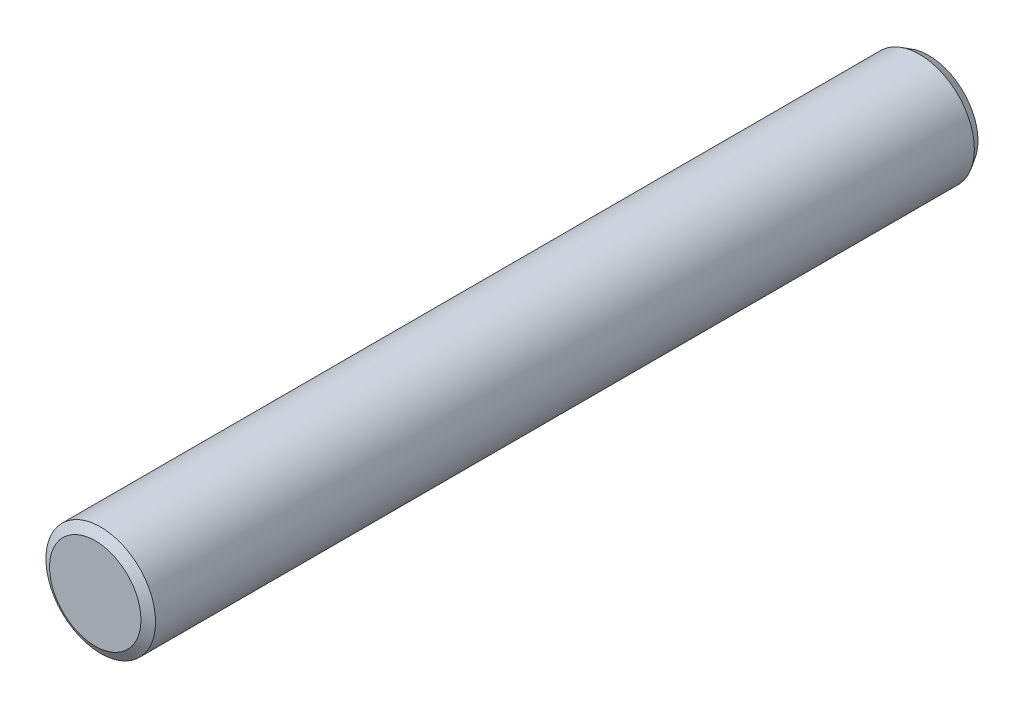
ISO-10303-21;
HEADER;
FILE_DESCRIPTION(('STEP AP214'),'2;1');
FILE_NAME('part.step','',(''),(''),'','','');
FILE_SCHEMA(('AUTOMOTIVE_DESIGN { 1 0 10303 214 1 1 1 1 }'));
ENDSEC;
DATA;
#1=APPLICATION_CONTEXT('core data for automotive mechanical design processes');
#2=APPLICATION_PROTOCOL_DEFINITION('international standard','automotive_design',2000,#1);
#3=PRODUCT_CONTEXT('',#1,'mechanical');
#4=PRODUCT('Part','Part','',(#3));
#5=PRODUCT_RELATED_PRODUCT_CATEGORY('part','',(#4));
#6=PRODUCT_DEFINITION_FORMATION('','',#4);
#7=PRODUCT_DEFINITION_CONTEXT('part definition',#1,'design');
#8=PRODUCT_DEFINITION('design','',#6,#7);
#9=PRODUCT_DEFINITION_SHAPE('','',#8);
#10=(LENGTH_UNIT() NAMED_UNIT(*) SI_UNIT(.MILLI.,.METRE.));
#11=(NAMED_UNIT(*) PLANE_ANGLE_UNIT() SI_UNIT($,.RADIAN.));
#12=(NAMED_UNIT(*) SI_UNIT($,.STERADIAN.) SOLID_ANGLE_UNIT());
#13=UNCERTAINTY_MEASURE_WITH_UNIT(LENGTH_MEASURE(1.E-05),#10,'distance_accuracy_value','');
#14=(GEOMETRIC_REPRESENTATION_CONTEXT(3) GLOBAL_UNCERTAINTY_ASSIGNED_CONTEXT((#13)) GLOBAL_UNIT_ASSIGNED_CONTEXT((#10,
#11,#12)) REPRESENTATION_CONTEXT('',''));
#15=CARTESIAN_POINT('',(0.,0.,0.));
#16=DIRECTION('',(0.,0.,1.));
#17=DIRECTION('',(1.,0.,0.));
#18=AXIS2_PLACEMENT_3D('',#15,#16,#17);
#19=CARTESIAN_POINT('',(0.,0.,76.));
#20=DIRECTION('',(0.,0.,-1.));
#21=DIRECTION('',(-1.,0.,0.));
#22=AXIS2_PLACEMENT_3D('',#19,#20,#21);
#23=CYLINDRICAL_SURFACE('',#22,5.);
#24=CARTESIAN_POINT('',(0.,0.,0.832139741175242));
#25=DIRECTION('',(0.,0.,1.));
#26=DIRECTION('',(1.,0.,0.));
#27=AXIS2_PLACEMENT_3D('',#24,#25,#26);
#28=CIRCLE('',#27,5.);
#29=CARTESIAN_POINT('',(5.,0.,0.832139741175242));
#30=VERTEX_POINT('',#29);
#31=EDGE_CURVE('E51',#30,#30,#28,.T.);
#32=ORIENTED_EDGE('',*,*,#31,.T.);
#33=EDGE_LOOP('',(#32));
#34=FACE_BOUND('',#33,.T.);
#35=CARTESIAN_POINT('',(0.,0.,75.5));
#36=DIRECTION('',(0.,0.,1.));
#37=DIRECTION('',(1.,0.,0.));
#38=AXIS2_PLACEMENT_3D('',#35,#36,#37);
#39=CIRCLE('',#38,5.);
#40=CARTESIAN_POINT('',(5.,0.,75.5));
#41=VERTEX_POINT('',#40);
#42=EDGE_CURVE('E55',#41,#41,#39,.F.);
#43=ORIENTED_EDGE('',*,*,#42,.T.);
#44=EDGE_LOOP('',(#43));
#45=FACE_BOUND('',#44,.T.);
#46=ADVANCED_FACE('F39',(#34,#45),#23,.T.);
#47=CARTESIAN_POINT('',(0.,0.,76.));
#48=DIRECTION('',(0.,0.,1.));
#49=DIRECTION('',(1.,0.,0.));
#50=AXIS2_PLACEMENT_3D('',#47,#48,#49);
#51=PLANE('',#50);
#52=CARTESIAN_POINT('',(0.,0.,76.));
#53=DIRECTION('',(0.,0.,1.));
#54=DIRECTION('',(1.,0.,0.));
#55=AXIS2_PLACEMENT_3D('',#52,#53,#54);
#56=CIRCLE('',#55,4.16786025882475);
#57=CARTESIAN_POINT('',(4.16786025882475,0.,76.));
#58=VERTEX_POINT('',#57);
#59=EDGE_CURVE('E10',#58,#58,#56,.T.);
#60=ORIENTED_EDGE('',*,*,#59,.T.);
#61=EDGE_LOOP('',(#60));
#62=FACE_BOUND('',#61,.T.);
#63=ADVANCED_FACE('F71',(#62),#51,.T.);
#64=CARTESIAN_POINT('',(0.,0.,0.));
#65=DIRECTION('',(0.,0.,1.));
#66=DIRECTION('',(1.,0.,0.));
#67=AXIS2_PLACEMENT_3D('',#64,#65,#66);
#68=PLANE('',#67);
#69=CARTESIAN_POINT('',(0.,0.,0.));
#70=DIRECTION('',(0.,0.,1.));
#71=DIRECTION('',(1.,0.,0.));
#72=AXIS2_PLACEMENT_3D('',#69,#70,#71);
#73=CIRCLE('',#72,4.50000000000001);
#74=CARTESIAN_POINT('',(4.50000000000001,0.,0.));
#75=VERTEX_POINT('',#74);
#76=EDGE_CURVE('E47',#75,#75,#73,.F.);
#77=ORIENTED_EDGE('',*,*,#76,.T.);
#78=EDGE_LOOP('',(#77));
#79=FACE_BOUND('',#78,.T.);
#80=ADVANCED_FACE('F68',(#79),#68,.F.);
#81=CARTESIAN_POINT('',(0.,0.,0.832139741175242));
#82=DIRECTION('',(0.,0.,1.));
#83=DIRECTION('',(1.,0.,0.));
#84=AXIS2_PLACEMENT_3D('',#81,#82,#83);
#85=CONICAL_SURFACE('',#84,5.,0.541052068118242);
#86=ORIENTED_EDGE('',*,*,#76,.F.);
#87=EDGE_LOOP('',(#86));
#88=FACE_BOUND('',#87,.T.);
#89=ORIENTED_EDGE('',*,*,#31,.F.);
#90=EDGE_LOOP('',(#89));
#91=FACE_BOUND('',#90,.T.);
#92=ADVANCED_FACE('F64',(#88,#91),#85,.T.);
#93=CARTESIAN_POINT('',(0.,0.,76.));
#94=DIRECTION('',(0.,0.,-1.));
#95=DIRECTION('',(-1.,0.,0.));
#96=AXIS2_PLACEMENT_3D('',#93,#94,#95);
#97=CONICAL_SURFACE('',#96,4.16786025882475,1.02974425867665);
#98=ORIENTED_EDGE('',*,*,#42,.F.);
#99=EDGE_LOOP('',(#98));
#100=FACE_BOUND('',#99,.T.);
#101=ORIENTED_EDGE('',*,*,#59,.F.);
#102=EDGE_LOOP('',(#101));
#103=FACE_BOUND('',#102,.T.);
#104=ADVANCED_FACE('F42',(#100,#103),#97,.T.);
#105=CLOSED_SHELL('',(#46,#63,#80,#92,#104));
#106=MANIFOLD_SOLID_BREP('B2',#105);
#107=ADVANCED_BREP_SHAPE_REPRESENTATION('',(#18,#106),#14);
#108=SHAPE_DEFINITION_REPRESENTATION(#9,#107);
ENDSEC;
END-ISO-10303-21;
